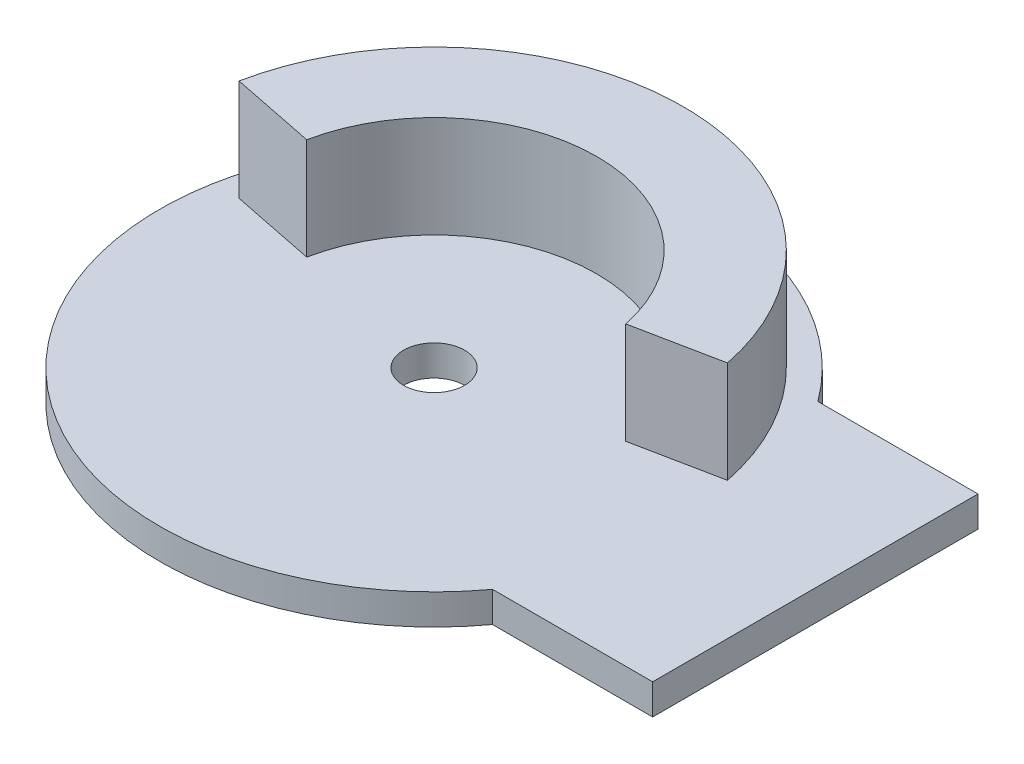
ISO-10303-21;
HEADER;
FILE_DESCRIPTION(('STEP AP214'),'2;1');
FILE_NAME('part.step','',(''),(''),'','','');
FILE_SCHEMA(('AUTOMOTIVE_DESIGN { 1 0 10303 214 1 1 1 1 }'));
ENDSEC;
DATA;
#1=APPLICATION_CONTEXT('core data for automotive mechanical design processes');
#2=APPLICATION_PROTOCOL_DEFINITION('international standard','automotive_design',2000,#1);
#3=PRODUCT_CONTEXT('',#1,'mechanical');
#4=PRODUCT('Part','Part','',(#3));
#5=PRODUCT_RELATED_PRODUCT_CATEGORY('part','',(#4));
#6=PRODUCT_DEFINITION_FORMATION('','',#4);
#7=PRODUCT_DEFINITION_CONTEXT('part definition',#1,'design');
#8=PRODUCT_DEFINITION('design','',#6,#7);
#9=PRODUCT_DEFINITION_SHAPE('','',#8);
#10=(LENGTH_UNIT() NAMED_UNIT(*) SI_UNIT(.MILLI.,.METRE.));
#11=(NAMED_UNIT(*) PLANE_ANGLE_UNIT() SI_UNIT($,.RADIAN.));
#12=(NAMED_UNIT(*) SI_UNIT($,.STERADIAN.) SOLID_ANGLE_UNIT());
#13=UNCERTAINTY_MEASURE_WITH_UNIT(LENGTH_MEASURE(1.E-05),#10,'distance_accuracy_value','');
#14=(GEOMETRIC_REPRESENTATION_CONTEXT(3) GLOBAL_UNCERTAINTY_ASSIGNED_CONTEXT((#13)) GLOBAL_UNIT_ASSIGNED_CONTEXT((#10,
#11,#12)) REPRESENTATION_CONTEXT('',''));
#15=CARTESIAN_POINT('',(0.,0.,0.));
#16=DIRECTION('',(0.,0.,1.));
#17=DIRECTION('',(1.,0.,0.));
#18=AXIS2_PLACEMENT_3D('',#15,#16,#17);
#19=CARTESIAN_POINT('',(-24.017268370967,10.,-4.83950617283951));
#20=DIRECTION('',(0.19753086419753,0.,-0.980296668202732));
#21=DIRECTION('',(-0.980296668202732,0.,-0.19753086419753));
#22=AXIS2_PLACEMENT_3D('',#19,#20,#21);
#23=PLANE('',#22);
#24=DIRECTION('',(0.980296668202732,0.,0.19753086419753));
#25=VECTOR('',#24,1.);
#26=CARTESIAN_POINT('',(-24.017268370967,0.,-4.83950617283951));
#27=LINE('',#26,#25);
#28=CARTESIAN_POINT('',(-24.017268370967,0.,-4.8395061728395));
#29=VERTEX_POINT('',#28);
#30=CARTESIAN_POINT('',(-15.6847466912437,0.,-3.16049382716048));
#31=VERTEX_POINT('',#30);
#32=EDGE_CURVE('E120',#29,#31,#27,.T.);
#33=ORIENTED_EDGE('',*,*,#32,.T.);
#34=DIRECTION('',(0.,-1.,0.));
#35=VECTOR('',#34,1.);
#36=CARTESIAN_POINT('',(-15.6847466912437,10.,-3.16049382716048));
#37=LINE('',#36,#35);
#38=CARTESIAN_POINT('',(-15.6847466912437,10.,-3.16049382716048));
#39=VERTEX_POINT('',#38);
#40=EDGE_CURVE('E11',#39,#31,#37,.T.);
#41=ORIENTED_EDGE('',*,*,#40,.F.);
#42=DIRECTION('',(0.980296668202732,0.,0.19753086419753));
#43=VECTOR('',#42,1.);
#44=CARTESIAN_POINT('',(-24.017268370967,10.,-4.83950617283951));
#45=LINE('',#44,#43);
#46=CARTESIAN_POINT('',(-24.017268370967,10.,-4.8395061728395));
#47=VERTEX_POINT('',#46);
#48=EDGE_CURVE('E129',#47,#39,#45,.T.);
#49=ORIENTED_EDGE('',*,*,#48,.F.);
#50=DIRECTION('',(0.,-1.,0.));
#51=VECTOR('',#50,1.);
#52=CARTESIAN_POINT('',(-24.017268370967,10.,-4.8395061728395));
#53=LINE('',#52,#51);
#54=EDGE_CURVE('E50',#47,#29,#53,.T.);
#55=ORIENTED_EDGE('',*,*,#54,.T.);
#56=EDGE_LOOP('',(#33,#41,#49,#55));
#57=FACE_BOUND('',#56,.T.);
#58=ADVANCED_FACE('F35',(#57),#23,.F.);
#59=CARTESIAN_POINT('',(0.,10.,0.));
#60=DIRECTION('',(0.,-1.,0.));
#61=DIRECTION('',(0.,0.,-1.));
#62=AXIS2_PLACEMENT_3D('',#59,#60,#61);
#63=CYLINDRICAL_SURFACE('',#62,16.);
#64=CARTESIAN_POINT('',(0.,0.,0.));
#65=DIRECTION('',(0.,-1.,0.));
#66=DIRECTION('',(0.,0.,-1.));
#67=AXIS2_PLACEMENT_3D('',#64,#65,#66);
#68=CIRCLE('',#67,16.);
#69=CARTESIAN_POINT('',(15.6847466912437,0.,-3.16049382716049));
#70=VERTEX_POINT('',#69);
#71=EDGE_CURVE('E123',#31,#70,#68,.T.);
#72=ORIENTED_EDGE('',*,*,#71,.T.);
#73=DIRECTION('',(0.,-1.,0.));
#74=VECTOR('',#73,1.);
#75=CARTESIAN_POINT('',(15.6847466912437,10.,-3.16049382716049));
#76=LINE('',#75,#74);
#77=CARTESIAN_POINT('',(15.6847466912437,10.,-3.16049382716049));
#78=VERTEX_POINT('',#77);
#79=EDGE_CURVE('E43',#78,#70,#76,.T.);
#80=ORIENTED_EDGE('',*,*,#79,.F.);
#81=CARTESIAN_POINT('',(0.,10.,0.));
#82=DIRECTION('',(0.,-1.,0.));
#83=DIRECTION('',(0.,0.,-1.));
#84=AXIS2_PLACEMENT_3D('',#81,#82,#83);
#85=CIRCLE('',#84,16.);
#86=EDGE_CURVE('E132',#39,#78,#85,.T.);
#87=ORIENTED_EDGE('',*,*,#86,.F.);
#88=ORIENTED_EDGE('',*,*,#40,.T.);
#89=EDGE_LOOP('',(#72,#80,#87,#88));
#90=FACE_BOUND('',#89,.T.);
#91=ADVANCED_FACE('F156',(#90),#63,.F.);
#92=CARTESIAN_POINT('',(24.017268370967,10.,-4.83950617283951));
#93=DIRECTION('',(0.19753086419753,0.,0.980296668202732));
#94=DIRECTION('',(0.980296668202732,0.,-0.19753086419753));
#95=AXIS2_PLACEMENT_3D('',#92,#93,#94);
#96=PLANE('',#95);
#97=DIRECTION('',(-0.980296668202732,0.,0.19753086419753));
#98=VECTOR('',#97,1.);
#99=CARTESIAN_POINT('',(24.017268370967,0.,-4.83950617283951));
#100=LINE('',#99,#98);
#101=CARTESIAN_POINT('',(24.017268370967,0.,-4.8395061728395));
#102=VERTEX_POINT('',#101);
#103=EDGE_CURVE('E142',#102,#70,#100,.T.);
#104=ORIENTED_EDGE('',*,*,#103,.F.);
#105=DIRECTION('',(0.,-1.,0.));
#106=VECTOR('',#105,1.);
#107=CARTESIAN_POINT('',(24.017268370967,10.,-4.8395061728395));
#108=LINE('',#107,#106);
#109=CARTESIAN_POINT('',(24.017268370967,10.,-4.8395061728395));
#110=VERTEX_POINT('',#109);
#111=EDGE_CURVE('E147',#110,#102,#108,.T.);
#112=ORIENTED_EDGE('',*,*,#111,.F.);
#113=DIRECTION('',(-0.980296668202732,0.,0.19753086419753));
#114=VECTOR('',#113,1.);
#115=CARTESIAN_POINT('',(24.017268370967,10.,-4.83950617283951));
#116=LINE('',#115,#114);
#117=EDGE_CURVE('E135',#110,#78,#116,.T.);
#118=ORIENTED_EDGE('',*,*,#117,.T.);
#119=ORIENTED_EDGE('',*,*,#79,.T.);
#120=EDGE_LOOP('',(#104,#112,#118,#119));
#121=FACE_BOUND('',#120,.T.);
#122=ADVANCED_FACE('F153',(#121),#96,.T.);
#123=CARTESIAN_POINT('',(0.,10.,1.28369537222284E-13));
#124=DIRECTION('',(0.,-1.,0.));
#125=DIRECTION('',(0.,0.,-1.));
#126=AXIS2_PLACEMENT_3D('',#123,#124,#125);
#127=CYLINDRICAL_SURFACE('',#126,24.5000000000001);
#128=CARTESIAN_POINT('',(0.,0.,1.28369537222284E-13));
#129=DIRECTION('',(0.,-1.,0.));
#130=DIRECTION('',(0.,0.,-1.));
#131=AXIS2_PLACEMENT_3D('',#128,#129,#130);
#132=CIRCLE('',#131,24.5000000000001);
#133=EDGE_CURVE('E133',#29,#102,#132,.T.);
#134=ORIENTED_EDGE('',*,*,#133,.F.);
#135=ORIENTED_EDGE('',*,*,#54,.F.);
#136=CARTESIAN_POINT('',(0.,10.,1.28369537222284E-13));
#137=DIRECTION('',(0.,-1.,0.));
#138=DIRECTION('',(0.,0.,-1.));
#139=AXIS2_PLACEMENT_3D('',#136,#137,#138);
#140=CIRCLE('',#139,24.5000000000001);
#141=EDGE_CURVE('E138',#47,#110,#140,.T.);
#142=ORIENTED_EDGE('',*,*,#141,.T.);
#143=ORIENTED_EDGE('',*,*,#111,.T.);
#144=EDGE_LOOP('',(#134,#135,#142,#143));
#145=FACE_BOUND('',#144,.T.);
#146=ADVANCED_FACE('F160',(#145),#127,.T.);
#147=CARTESIAN_POINT('',(0.,10.,0.));
#148=DIRECTION('',(0.,-1.,0.));
#149=DIRECTION('',(0.,0.,-1.));
#150=AXIS2_PLACEMENT_3D('',#147,#148,#149);
#151=PLANE('',#150);
#152=ORIENTED_EDGE('',*,*,#48,.T.);
#153=ORIENTED_EDGE('',*,*,#86,.T.);
#154=ORIENTED_EDGE('',*,*,#117,.F.);
#155=ORIENTED_EDGE('',*,*,#141,.F.);
#156=EDGE_LOOP('',(#152,#153,#154,#155));
#157=FACE_BOUND('',#156,.T.);
#158=ADVANCED_FACE('F163',(#157),#151,.F.);
#159=CARTESIAN_POINT('',(-2.46330733588707E-13,0.,4.85722573273506E-13));
#160=DIRECTION('',(0.,1.,0.));
#161=DIRECTION('',(0.,0.,1.));
#162=AXIS2_PLACEMENT_3D('',#159,#160,#161);
#163=PLANE('',#162);
#164=CARTESIAN_POINT('',(0.,0.,0.));
#165=DIRECTION('',(0.,-1.,0.));
#166=DIRECTION('',(0.,0.,-1.));
#167=AXIS2_PLACEMENT_3D('',#164,#165,#166);
#168=CIRCLE('',#167,3.);
#169=CARTESIAN_POINT('',(0.,0.,-3.));
#170=VERTEX_POINT('',#169);
#171=EDGE_CURVE('E206',#170,#170,#168,.T.);
#172=ORIENTED_EDGE('',*,*,#171,.T.);
#173=EDGE_LOOP('',(#172));
#174=FACE_BOUND('',#173,.T.);
#175=DIRECTION('',(1.,0.,0.));
#176=VECTOR('',#175,1.);
#177=CARTESIAN_POINT('',(21.7485631709316,0.,-16.));
#178=LINE('',#177,#176);
#179=CARTESIAN_POINT('',(21.7485631709316,0.,-16.));
#180=VERTEX_POINT('',#179);
#181=CARTESIAN_POINT('',(37.5,0.,-16.));
#182=VERTEX_POINT('',#181);
#183=EDGE_CURVE('E208',#180,#182,#178,.T.);
#184=ORIENTED_EDGE('',*,*,#183,.F.);
#185=CARTESIAN_POINT('',(0.,0.,0.));
#186=DIRECTION('',(0.,-1.,0.));
#187=DIRECTION('',(0.,0.,1.));
#188=AXIS2_PLACEMENT_3D('',#185,#186,#187);
#189=CIRCLE('',#188,27.);
#190=CARTESIAN_POINT('',(21.7485631709316,0.,16.));
#191=VERTEX_POINT('',#190);
#192=EDGE_CURVE('E116',#191,#180,#189,.T.);
#193=ORIENTED_EDGE('',*,*,#192,.F.);
#194=DIRECTION('',(-1.,0.,0.));
#195=VECTOR('',#194,1.);
#196=CARTESIAN_POINT('',(21.7485631709316,0.,16.));
#197=LINE('',#196,#195);
#198=CARTESIAN_POINT('',(37.5,0.,16.));
#199=VERTEX_POINT('',#198);
#200=EDGE_CURVE('E217',#199,#191,#197,.T.);
#201=ORIENTED_EDGE('',*,*,#200,.F.);
#202=DIRECTION('',(0.,0.,1.));
#203=VECTOR('',#202,1.);
#204=CARTESIAN_POINT('',(37.5,0.,-16.));
#205=LINE('',#204,#203);
#206=EDGE_CURVE('E215',#182,#199,#205,.T.);
#207=ORIENTED_EDGE('',*,*,#206,.F.);
#208=EDGE_LOOP('',(#184,#193,#201,#207));
#209=FACE_BOUND('',#208,.T.);
#210=ORIENTED_EDGE('',*,*,#32,.F.);
#211=ORIENTED_EDGE('',*,*,#133,.T.);
#212=ORIENTED_EDGE('',*,*,#103,.T.);
#213=ORIENTED_EDGE('',*,*,#71,.F.);
#214=EDGE_LOOP('',(#210,#211,#212,#213));
#215=FACE_BOUND('',#214,.T.);
#216=ADVANCED_FACE('F159',(#174,#209,#215),#163,.T.);
#217=CARTESIAN_POINT('',(-2.46330733588707E-13,-3.,4.85722573273506E-13));
#218=DIRECTION('',(0.,1.,0.));
#219=DIRECTION('',(0.,0.,1.));
#220=AXIS2_PLACEMENT_3D('',#217,#218,#219);
#221=PLANE('',#220);
#222=CARTESIAN_POINT('',(-2.46330733588707E-13,-3.,4.85722573273506E-13));
#223=DIRECTION('',(0.,-1.,0.));
#224=DIRECTION('',(0.,0.,1.));
#225=AXIS2_PLACEMENT_3D('',#222,#223,#224);
#226=CIRCLE('',#225,27.0000000000005);
#227=CARTESIAN_POINT('',(21.7485631709316,-3.,16.));
#228=VERTEX_POINT('',#227);
#229=CARTESIAN_POINT('',(21.7485631709316,-3.,-16.));
#230=VERTEX_POINT('',#229);
#231=EDGE_CURVE('E106',#228,#230,#226,.T.);
#232=ORIENTED_EDGE('',*,*,#231,.T.);
#233=DIRECTION('',(1.,0.,0.));
#234=VECTOR('',#233,1.);
#235=CARTESIAN_POINT('',(21.7485631709316,-3.,-16.));
#236=LINE('',#235,#234);
#237=CARTESIAN_POINT('',(37.5,-3.,-16.));
#238=VERTEX_POINT('',#237);
#239=EDGE_CURVE('E96',#230,#238,#236,.T.);
#240=ORIENTED_EDGE('',*,*,#239,.T.);
#241=DIRECTION('',(0.,0.,1.));
#242=VECTOR('',#241,1.);
#243=CARTESIAN_POINT('',(37.5,-3.,-16.));
#244=LINE('',#243,#242);
#245=CARTESIAN_POINT('',(37.5,-3.,16.));
#246=VERTEX_POINT('',#245);
#247=EDGE_CURVE('E105',#238,#246,#244,.T.);
#248=ORIENTED_EDGE('',*,*,#247,.T.);
#249=DIRECTION('',(-1.,0.,0.));
#250=VECTOR('',#249,1.);
#251=CARTESIAN_POINT('',(21.7485631709316,-3.,16.));
#252=LINE('',#251,#250);
#253=EDGE_CURVE('E112',#246,#228,#252,.T.);
#254=ORIENTED_EDGE('',*,*,#253,.T.);
#255=EDGE_LOOP('',(#232,#240,#248,#254));
#256=FACE_BOUND('',#255,.T.);
#257=CARTESIAN_POINT('',(0.,-3.,0.));
#258=DIRECTION('',(0.,-1.,0.));
#259=DIRECTION('',(0.,0.,-1.));
#260=AXIS2_PLACEMENT_3D('',#257,#258,#259);
#261=CIRCLE('',#260,3.);
#262=CARTESIAN_POINT('',(0.,-3.,-3.));
#263=VERTEX_POINT('',#262);
#264=EDGE_CURVE('E203',#263,#263,#261,.T.);
#265=ORIENTED_EDGE('',*,*,#264,.F.);
#266=EDGE_LOOP('',(#265));
#267=FACE_BOUND('',#266,.T.);
#268=ADVANCED_FACE('F109',(#256,#267),#221,.F.);
#269=CARTESIAN_POINT('',(21.7485631709316,-3.,-16.));
#270=DIRECTION('',(0.,0.,1.));
#271=DIRECTION('',(1.,0.,0.));
#272=AXIS2_PLACEMENT_3D('',#269,#270,#271);
#273=PLANE('',#272);
#274=ORIENTED_EDGE('',*,*,#183,.T.);
#275=DIRECTION('',(0.,1.,0.));
#276=VECTOR('',#275,1.);
#277=CARTESIAN_POINT('',(37.5,-3.,-16.));
#278=LINE('',#277,#276);
#279=EDGE_CURVE('E102',#238,#182,#278,.T.);
#280=ORIENTED_EDGE('',*,*,#279,.F.);
#281=ORIENTED_EDGE('',*,*,#239,.F.);
#282=DIRECTION('',(0.,1.,0.));
#283=VECTOR('',#282,1.);
#284=CARTESIAN_POINT('',(21.7485631709316,-3.,-16.));
#285=LINE('',#284,#283);
#286=EDGE_CURVE('E100',#230,#180,#285,.T.);
#287=ORIENTED_EDGE('',*,*,#286,.T.);
#288=EDGE_LOOP('',(#274,#280,#281,#287));
#289=FACE_BOUND('',#288,.T.);
#290=ADVANCED_FACE('F98',(#289),#273,.F.);
#291=CARTESIAN_POINT('',(37.5,-3.,-16.));
#292=DIRECTION('',(-1.,0.,0.));
#293=DIRECTION('',(0.,0.,1.));
#294=AXIS2_PLACEMENT_3D('',#291,#292,#293);
#295=PLANE('',#294);
#296=ORIENTED_EDGE('',*,*,#206,.T.);
#297=DIRECTION('',(0.,1.,0.));
#298=VECTOR('',#297,1.);
#299=CARTESIAN_POINT('',(37.5,-3.,16.));
#300=LINE('',#299,#298);
#301=EDGE_CURVE('E125',#246,#199,#300,.T.);
#302=ORIENTED_EDGE('',*,*,#301,.F.);
#303=ORIENTED_EDGE('',*,*,#247,.F.);
#304=ORIENTED_EDGE('',*,*,#279,.T.);
#305=EDGE_LOOP('',(#296,#302,#303,#304));
#306=FACE_BOUND('',#305,.T.);
#307=ADVANCED_FACE('F180',(#306),#295,.F.);
#308=CARTESIAN_POINT('',(21.7485631709316,-3.,16.));
#309=DIRECTION('',(0.,0.,-1.));
#310=DIRECTION('',(-1.,0.,0.));
#311=AXIS2_PLACEMENT_3D('',#308,#309,#310);
#312=PLANE('',#311);
#313=ORIENTED_EDGE('',*,*,#200,.T.);
#314=DIRECTION('',(0.,1.,0.));
#315=VECTOR('',#314,1.);
#316=CARTESIAN_POINT('',(21.7485631709316,-3.,16.));
#317=LINE('',#316,#315);
#318=EDGE_CURVE('E213',#228,#191,#317,.T.);
#319=ORIENTED_EDGE('',*,*,#318,.F.);
#320=ORIENTED_EDGE('',*,*,#253,.F.);
#321=ORIENTED_EDGE('',*,*,#301,.T.);
#322=EDGE_LOOP('',(#313,#319,#320,#321));
#323=FACE_BOUND('',#322,.T.);
#324=ADVANCED_FACE('F183',(#323),#312,.F.);
#325=CARTESIAN_POINT('',(0.,-3.,0.));
#326=DIRECTION('',(0.,1.,0.));
#327=DIRECTION('',(0.,0.,1.));
#328=AXIS2_PLACEMENT_3D('',#325,#326,#327);
#329=CYLINDRICAL_SURFACE('',#328,27.);
#330=ORIENTED_EDGE('',*,*,#192,.T.);
#331=ORIENTED_EDGE('',*,*,#286,.F.);
#332=ORIENTED_EDGE('',*,*,#231,.F.);
#333=ORIENTED_EDGE('',*,*,#318,.T.);
#334=EDGE_LOOP('',(#330,#331,#332,#333));
#335=FACE_BOUND('',#334,.T.);
#336=ADVANCED_FACE('F118',(#335),#329,.T.);
#337=CARTESIAN_POINT('',(0.,-3.,0.));
#338=DIRECTION('',(0.,1.,0.));
#339=DIRECTION('',(0.,0.,1.));
#340=AXIS2_PLACEMENT_3D('',#337,#338,#339);
#341=CYLINDRICAL_SURFACE('',#340,3.);
#342=ORIENTED_EDGE('',*,*,#264,.T.);
#343=EDGE_LOOP('',(#342));
#344=FACE_BOUND('',#343,.T.);
#345=ORIENTED_EDGE('',*,*,#171,.F.);
#346=EDGE_LOOP('',(#345));
#347=FACE_BOUND('',#346,.T.);
#348=ADVANCED_FACE('F190',(#344,#347),#341,.F.);
#349=CLOSED_SHELL('',(#58,#91,#122,#146,#158,#216,#268,#290,#307,#324,#336,#348));
#350=MANIFOLD_SOLID_BREP('B2',#349);
#351=ADVANCED_BREP_SHAPE_REPRESENTATION('',(#18,#350),#14);
#352=SHAPE_DEFINITION_REPRESENTATION(#9,#351);
ENDSEC;
END-ISO-10303-21;
